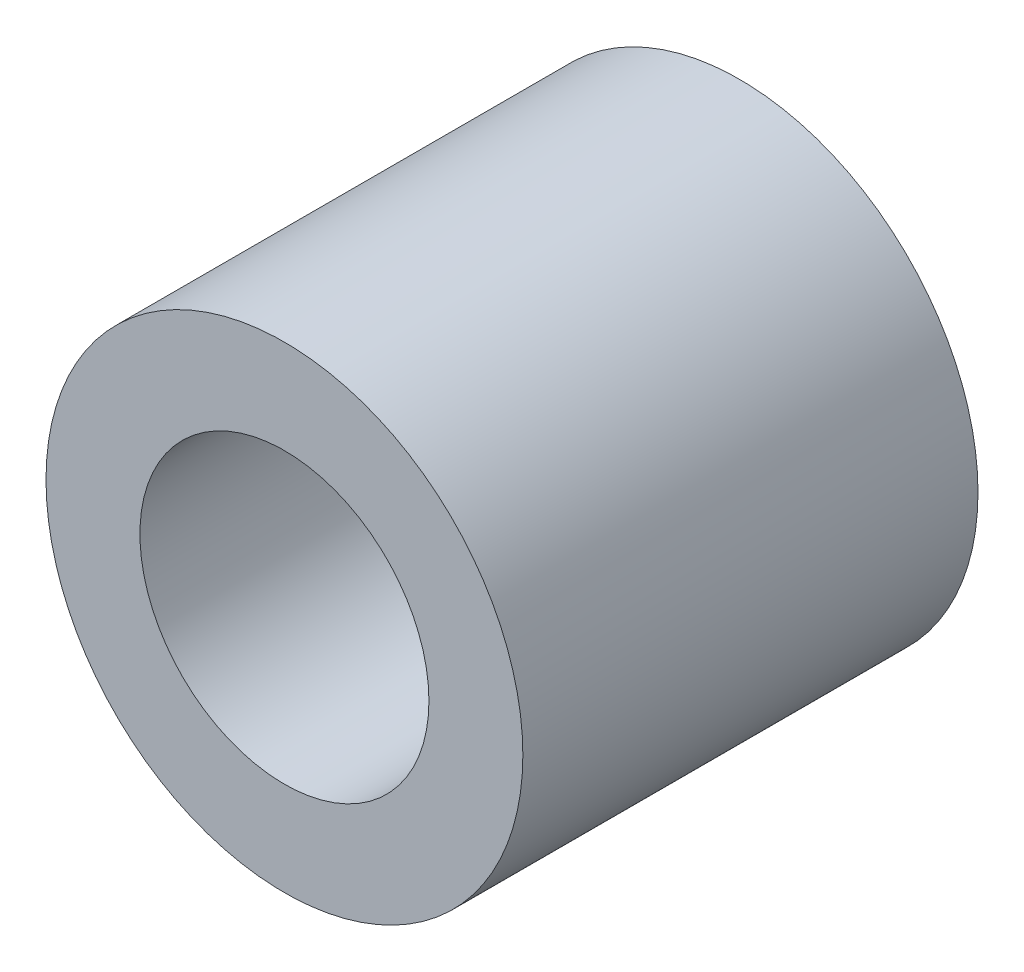
ISO-10303-21;
HEADER;
FILE_DESCRIPTION(('STEP AP214'),'2;1');
FILE_NAME('part.step','',(''),(''),'','','');
FILE_SCHEMA(('AUTOMOTIVE_DESIGN { 1 0 10303 214 1 1 1 1 }'));
ENDSEC;
DATA;
#1=APPLICATION_CONTEXT('core data for automotive mechanical design processes');
#2=APPLICATION_PROTOCOL_DEFINITION('international standard','automotive_design',2000,#1);
#3=PRODUCT_CONTEXT('',#1,'mechanical');
#4=PRODUCT('Part','Part','',(#3));
#5=PRODUCT_RELATED_PRODUCT_CATEGORY('part','',(#4));
#6=PRODUCT_DEFINITION_FORMATION('','',#4);
#7=PRODUCT_DEFINITION_CONTEXT('part definition',#1,'design');
#8=PRODUCT_DEFINITION('design','',#6,#7);
#9=PRODUCT_DEFINITION_SHAPE('','',#8);
#10=(LENGTH_UNIT() NAMED_UNIT(*) SI_UNIT(.MILLI.,.METRE.));
#11=(NAMED_UNIT(*) PLANE_ANGLE_UNIT() SI_UNIT($,.RADIAN.));
#12=(NAMED_UNIT(*) SI_UNIT($,.STERADIAN.) SOLID_ANGLE_UNIT());
#13=UNCERTAINTY_MEASURE_WITH_UNIT(LENGTH_MEASURE(1.E-05),#10,'distance_accuracy_value','');
#14=(GEOMETRIC_REPRESENTATION_CONTEXT(3) GLOBAL_UNCERTAINTY_ASSIGNED_CONTEXT((#13)) GLOBAL_UNIT_ASSIGNED_CONTEXT((#10,
#11,#12)) REPRESENTATION_CONTEXT('',''));
#15=CARTESIAN_POINT('',(0.,0.,0.));
#16=DIRECTION('',(0.,0.,1.));
#17=DIRECTION('',(1.,0.,0.));
#18=AXIS2_PLACEMENT_3D('',#15,#16,#17);
#19=CARTESIAN_POINT('',(0.,0.,20.));
#20=DIRECTION('',(0.,0.,1.));
#21=DIRECTION('',(1.,0.,0.));
#22=AXIS2_PLACEMENT_3D('',#19,#20,#21);
#23=PLANE('',#22);
#24=CARTESIAN_POINT('',(0.,0.,20.));
#25=DIRECTION('',(0.,0.,1.));
#26=DIRECTION('',(1.,0.,0.));
#27=AXIS2_PLACEMENT_3D('',#24,#25,#26);
#28=CIRCLE('',#27,10.4775);
#29=CARTESIAN_POINT('',(10.4775,0.,20.));
#30=VERTEX_POINT('',#29);
#31=EDGE_CURVE('E10',#30,#30,#28,.T.);
#32=ORIENTED_EDGE('',*,*,#31,.T.);
#33=EDGE_LOOP('',(#32));
#34=FACE_BOUND('',#33,.T.);
#35=CARTESIAN_POINT('',(0.,0.,20.));
#36=DIRECTION('',(0.,0.,1.));
#37=DIRECTION('',(1.,0.,0.));
#38=AXIS2_PLACEMENT_3D('',#35,#36,#37);
#39=CIRCLE('',#38,6.35);
#40=CARTESIAN_POINT('',(6.35,0.,20.));
#41=VERTEX_POINT('',#40);
#42=EDGE_CURVE('E54',#41,#41,#39,.T.);
#43=ORIENTED_EDGE('',*,*,#42,.F.);
#44=EDGE_LOOP('',(#43));
#45=FACE_BOUND('',#44,.T.);
#46=ADVANCED_FACE('F43',(#34,#45),#23,.T.);
#47=CARTESIAN_POINT('',(0.,0.,0.));
#48=DIRECTION('',(0.,0.,1.));
#49=DIRECTION('',(1.,0.,0.));
#50=AXIS2_PLACEMENT_3D('',#47,#48,#49);
#51=PLANE('',#50);
#52=CARTESIAN_POINT('',(0.,0.,0.));
#53=DIRECTION('',(0.,0.,1.));
#54=DIRECTION('',(1.,0.,0.));
#55=AXIS2_PLACEMENT_3D('',#52,#53,#54);
#56=CIRCLE('',#55,10.4775);
#57=CARTESIAN_POINT('',(10.4775,0.,0.));
#58=VERTEX_POINT('',#57);
#59=EDGE_CURVE('E47',#58,#58,#56,.T.);
#60=ORIENTED_EDGE('',*,*,#59,.F.);
#61=EDGE_LOOP('',(#60));
#62=FACE_BOUND('',#61,.T.);
#63=CARTESIAN_POINT('',(0.,0.,0.));
#64=DIRECTION('',(0.,0.,1.));
#65=DIRECTION('',(1.,0.,0.));
#66=AXIS2_PLACEMENT_3D('',#63,#64,#65);
#67=CIRCLE('',#66,6.35);
#68=CARTESIAN_POINT('',(6.35,0.,0.));
#69=VERTEX_POINT('',#68);
#70=EDGE_CURVE('E56',#69,#69,#67,.T.);
#71=ORIENTED_EDGE('',*,*,#70,.T.);
#72=EDGE_LOOP('',(#71));
#73=FACE_BOUND('',#72,.T.);
#74=ADVANCED_FACE('F66',(#62,#73),#51,.F.);
#75=CARTESIAN_POINT('',(0.,0.,20.));
#76=DIRECTION('',(0.,0.,-1.));
#77=DIRECTION('',(-1.,0.,0.));
#78=AXIS2_PLACEMENT_3D('',#75,#76,#77);
#79=CYLINDRICAL_SURFACE('',#78,10.4775);
#80=ORIENTED_EDGE('',*,*,#31,.F.);
#81=EDGE_LOOP('',(#80));
#82=FACE_BOUND('',#81,.T.);
#83=ORIENTED_EDGE('',*,*,#59,.T.);
#84=EDGE_LOOP('',(#83));
#85=FACE_BOUND('',#84,.T.);
#86=ADVANCED_FACE('F45',(#82,#85),#79,.T.);
#87=CARTESIAN_POINT('',(0.,0.,20.));
#88=DIRECTION('',(0.,0.,-1.));
#89=DIRECTION('',(-1.,0.,0.));
#90=AXIS2_PLACEMENT_3D('',#87,#88,#89);
#91=CYLINDRICAL_SURFACE('',#90,6.35);
#92=ORIENTED_EDGE('',*,*,#42,.T.);
#93=EDGE_LOOP('',(#92));
#94=FACE_BOUND('',#93,.T.);
#95=ORIENTED_EDGE('',*,*,#70,.F.);
#96=EDGE_LOOP('',(#95));
#97=FACE_BOUND('',#96,.T.);
#98=ADVANCED_FACE('F62',(#94,#97),#91,.F.);
#99=CLOSED_SHELL('',(#46,#74,#86,#98));
#100=MANIFOLD_SOLID_BREP('B2',#99);
#101=ADVANCED_BREP_SHAPE_REPRESENTATION('',(#18,#100),#14);
#102=SHAPE_DEFINITION_REPRESENTATION(#9,#101);
ENDSEC;
END-ISO-10303-21;
